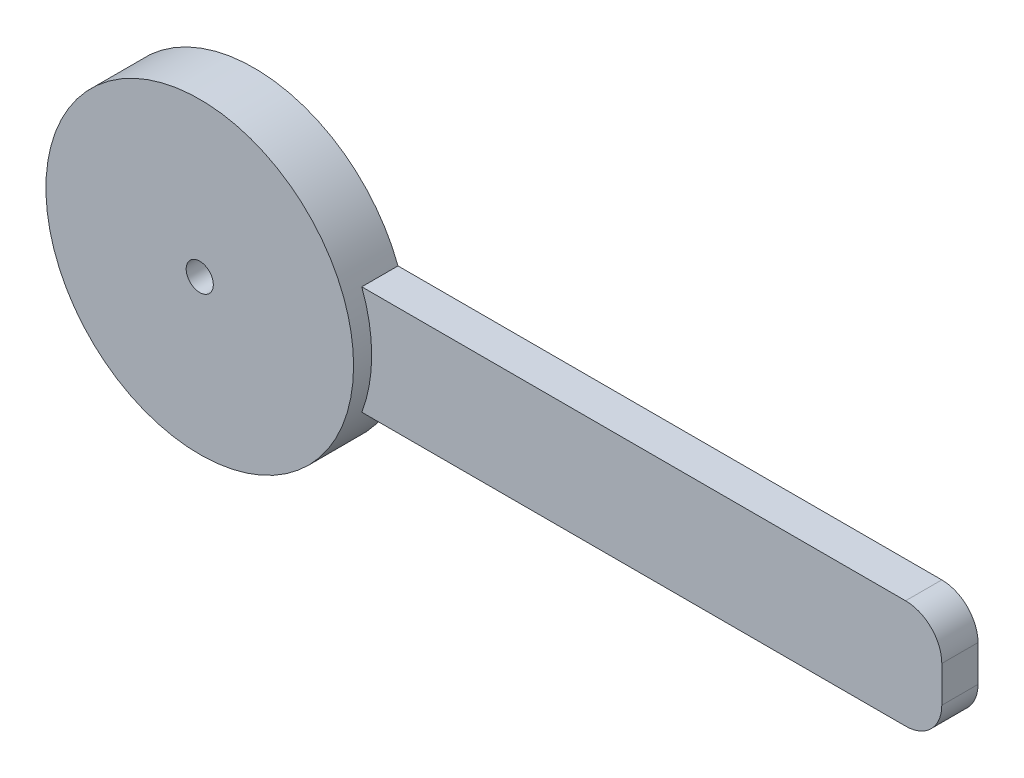
ISO-10303-21;
HEADER;
FILE_DESCRIPTION(('STEP AP214'),'2;1');
FILE_NAME('part.step','',(''),(''),'','','');
FILE_SCHEMA(('AUTOMOTIVE_DESIGN { 1 0 10303 214 1 1 1 1 }'));
ENDSEC;
DATA;
#1=APPLICATION_CONTEXT('core data for automotive mechanical design processes');
#2=APPLICATION_PROTOCOL_DEFINITION('international standard','automotive_design',2000,#1);
#3=PRODUCT_CONTEXT('',#1,'mechanical');
#4=PRODUCT('Part','Part','',(#3));
#5=PRODUCT_RELATED_PRODUCT_CATEGORY('part','',(#4));
#6=PRODUCT_DEFINITION_FORMATION('','',#4);
#7=PRODUCT_DEFINITION_CONTEXT('part definition',#1,'design');
#8=PRODUCT_DEFINITION('design','',#6,#7);
#9=PRODUCT_DEFINITION_SHAPE('','',#8);
#10=(LENGTH_UNIT() NAMED_UNIT(*) SI_UNIT(.MILLI.,.METRE.));
#11=(NAMED_UNIT(*) PLANE_ANGLE_UNIT() SI_UNIT($,.RADIAN.));
#12=(NAMED_UNIT(*) SI_UNIT($,.STERADIAN.) SOLID_ANGLE_UNIT());
#13=UNCERTAINTY_MEASURE_WITH_UNIT(LENGTH_MEASURE(1.E-05),#10,'distance_accuracy_value','');
#14=(GEOMETRIC_REPRESENTATION_CONTEXT(3) GLOBAL_UNCERTAINTY_ASSIGNED_CONTEXT((#13)) GLOBAL_UNIT_ASSIGNED_CONTEXT((#10,
#11,#12)) REPRESENTATION_CONTEXT('',''));
#15=CARTESIAN_POINT('',(0.,0.,0.));
#16=DIRECTION('',(0.,0.,1.));
#17=DIRECTION('',(1.,0.,0.));
#18=AXIS2_PLACEMENT_3D('',#15,#16,#17);
#19=CARTESIAN_POINT('',(-1.29206476969242,-9.55773939224529,1.));
#20=DIRECTION('',(-0.133966605224204,-0.990985846863971,0.));
#21=DIRECTION('',(0.990985846863971,-0.133966605224204,0.));
#22=AXIS2_PLACEMENT_3D('',#19,#20,#21);
#23=PLANE('',#22);
#24=DIRECTION('',(-0.990985846863971,0.133966605224203,0.));
#25=VECTOR('',#24,1.);
#26=CARTESIAN_POINT('',(-1.29206476969242,-9.55773939224529,1.));
#27=LINE('',#26,#25);
#28=CARTESIAN_POINT('',(-47.3521116164976,-3.33110342962163,1.));
#29=VERTEX_POINT('',#28);
#30=CARTESIAN_POINT('',(-53.5,-2.5,1.));
#31=VERTEX_POINT('',#30);
#32=EDGE_CURVE('E355',#29,#31,#27,.T.);
#33=ORIENTED_EDGE('',*,*,#32,.F.);
#34=DIRECTION('',(0.,0.,1.));
#35=VECTOR('',#34,1.);
#36=CARTESIAN_POINT('',(-47.3521116164976,-3.33110342962163,-2.));
#37=LINE('',#36,#35);
#38=CARTESIAN_POINT('',(-47.3521116164976,-3.33110342962163,-2.));
#39=VERTEX_POINT('',#38);
#40=EDGE_CURVE('E427',#29,#39,#37,.F.);
#41=ORIENTED_EDGE('',*,*,#40,.T.);
#42=DIRECTION('',(-0.990985846863971,0.133966605224203,0.));
#43=VECTOR('',#42,1.);
#44=CARTESIAN_POINT('',(-1.29206476969242,-9.55773939224529,-2.));
#45=LINE('',#44,#43);
#46=CARTESIAN_POINT('',(-53.5,-2.5,-2.));
#47=VERTEX_POINT('',#46);
#48=EDGE_CURVE('E363',#39,#47,#45,.T.);
#49=ORIENTED_EDGE('',*,*,#48,.T.);
#50=DIRECTION('',(0.,0.,-1.));
#51=VECTOR('',#50,1.);
#52=CARTESIAN_POINT('',(-53.5,-2.5,1.));
#53=LINE('',#52,#51);
#54=EDGE_CURVE('E361',#31,#47,#53,.T.);
#55=ORIENTED_EDGE('',*,*,#54,.F.);
#56=EDGE_LOOP('',(#33,#41,#49,#55));
#57=FACE_BOUND('',#56,.T.);
#58=ADVANCED_FACE('F43',(#57),#23,.F.);
#59=CARTESIAN_POINT('',(0.,0.,-2.));
#60=DIRECTION('',(0.,0.,-1.));
#61=DIRECTION('',(-1.,0.,0.));
#62=AXIS2_PLACEMENT_3D('',#59,#60,#61);
#63=PLANE('',#62);
#64=ORIENTED_EDGE('',*,*,#48,.F.);
#65=CARTESIAN_POINT('',(-47.4860782217218,-4.3220892764856,-2.));
#66=DIRECTION('',(0.,0.,-1.));
#67=DIRECTION('',(-1.,0.,0.));
#68=AXIS2_PLACEMENT_3D('',#65,#66,#67);
#69=CIRCLE('',#68,1.);
#70=CARTESIAN_POINT('',(-46.5608760009346,-4.70156371653466,-2.));
#71=VERTEX_POINT('',#70);
#72=EDGE_CURVE('E439',#39,#71,#69,.T.);
#73=ORIENTED_EDGE('',*,*,#72,.T.);
#74=DIRECTION('',(-0.379474440049075,-0.925202220787132,0.));
#75=VECTOR('',#74,1.);
#76=CARTESIAN_POINT('',(-28.9232775012814,38.3009249336115,-2.));
#77=LINE('',#76,#75);
#78=CARTESIAN_POINT('',(-48.9150635094612,-10.4413429510898,-2.));
#79=VERTEX_POINT('',#78);
#80=EDGE_CURVE('E265',#71,#79,#77,.T.);
#81=ORIENTED_EDGE('',*,*,#80,.T.);
#82=CARTESIAN_POINT('',(-46.7500000000001,-11.6913429510898,-2.));
#83=DIRECTION('',(0.,0.,-1.));
#84=DIRECTION('',(-0.50000000000001,-0.866025403784433,0.));
#85=AXIS2_PLACEMENT_3D('',#82,#83,#84);
#86=CIRCLE('',#85,2.5);
#87=CARTESIAN_POINT('',(-44.5849364905391,-12.9413429510899,-2.));
#88=VERTEX_POINT('',#87);
#89=EDGE_CURVE('E269',#88,#79,#86,.T.);
#90=ORIENTED_EDGE('',*,*,#89,.F.);
#91=DIRECTION('',(-0.611511406814916,-0.791235615562926,0.));
#92=VECTOR('',#91,1.);
#93=CARTESIAN_POINT('',(-12.3687872684102,28.7431855413661,-2.));
#94=LINE('',#93,#92);
#95=CARTESIAN_POINT('',(-40.791235615563,-8.03266714615628,-2.));
#96=VERTEX_POINT('',#95);
#97=EDGE_CURVE('E253',#96,#88,#94,.T.);
#98=ORIENTED_EDGE('',*,*,#97,.F.);
#99=CARTESIAN_POINT('',(-40.0000000000001,-8.64417855297121,-2.));
#100=DIRECTION('',(0.,0.,-1.));
#101=DIRECTION('',(-1.,0.,0.));
#102=AXIS2_PLACEMENT_3D('',#99,#100,#101);
#103=CIRCLE('',#102,1.);
#104=CARTESIAN_POINT('',(-39.2087643844372,-8.0326671461563,-2.));
#105=VERTEX_POINT('',#104);
#106=EDGE_CURVE('E429',#96,#105,#103,.T.);
#107=ORIENTED_EDGE('',*,*,#106,.T.);
#108=DIRECTION('',(0.6115114068149,-0.791235615562939,0.));
#109=VECTOR('',#108,1.);
#110=CARTESIAN_POINT('',(-67.6312127315892,28.7431855413666,-2.));
#111=LINE('',#110,#109);
#112=CARTESIAN_POINT('',(-35.4150635094612,-12.94134295109,-2.));
#113=VERTEX_POINT('',#112);
#114=EDGE_CURVE('E271',#105,#113,#111,.T.);
#115=ORIENTED_EDGE('',*,*,#114,.T.);
#116=CARTESIAN_POINT('',(-33.2500000000001,-11.69134295109,-2.));
#117=DIRECTION('',(0.,0.,-1.));
#118=DIRECTION('',(0.499999999999992,-0.866025403784443,0.));
#119=AXIS2_PLACEMENT_3D('',#116,#117,#118);
#120=CIRCLE('',#119,2.5);
#121=CARTESIAN_POINT('',(-31.084936490539,-10.44134295109,-2.));
#122=VERTEX_POINT('',#121);
#123=EDGE_CURVE('E276',#122,#113,#120,.T.);
#124=ORIENTED_EDGE('',*,*,#123,.F.);
#125=DIRECTION('',(0.379474440049056,-0.92520222078714,0.));
#126=VECTOR('',#125,1.);
#127=CARTESIAN_POINT('',(-51.0767224987178,38.3009249336118,-2.));
#128=LINE('',#127,#126);
#129=CARTESIAN_POINT('',(-33.4391239990655,-4.70156371653467,-2.));
#130=VERTEX_POINT('',#129);
#131=EDGE_CURVE('E283',#130,#122,#128,.T.);
#132=ORIENTED_EDGE('',*,*,#131,.F.);
#133=CARTESIAN_POINT('',(-32.5139217782784,-4.32208927648563,-2.));
#134=DIRECTION('',(0.,0.,-1.));
#135=DIRECTION('',(-1.,0.,0.));
#136=AXIS2_PLACEMENT_3D('',#133,#134,#135);
#137=CIRCLE('',#136,1.);
#138=CARTESIAN_POINT('',(-32.6478883835026,-3.33110342962165,-2.));
#139=VERTEX_POINT('',#138);
#140=EDGE_CURVE('E437',#130,#139,#137,.T.);
#141=ORIENTED_EDGE('',*,*,#140,.T.);
#142=DIRECTION('',(0.990985846863971,0.133966605224203,0.));
#143=VECTOR('',#142,1.);
#144=CARTESIAN_POINT('',(-78.7079352303076,-9.55773939224529,-2.));
#145=LINE('',#144,#143);
#146=CARTESIAN_POINT('',(-26.5,-2.5,-2.));
#147=VERTEX_POINT('',#146);
#148=EDGE_CURVE('E290',#139,#147,#145,.T.);
#149=ORIENTED_EDGE('',*,*,#148,.T.);
#150=CARTESIAN_POINT('',(-26.5,0.,-2.));
#151=DIRECTION('',(0.,0.,-1.));
#152=DIRECTION('',(1.,0.,0.));
#153=AXIS2_PLACEMENT_3D('',#150,#151,#152);
#154=CIRCLE('',#153,2.5);
#155=CARTESIAN_POINT('',(-26.5,2.5,-2.));
#156=VERTEX_POINT('',#155);
#157=EDGE_CURVE('E296',#156,#147,#154,.T.);
#158=ORIENTED_EDGE('',*,*,#157,.F.);
#159=DIRECTION('',(0.990985846863971,-0.133966605224203,0.));
#160=VECTOR('',#159,1.);
#161=CARTESIAN_POINT('',(-78.7079352303076,9.55773939224528,-2.));
#162=LINE('',#161,#160);
#163=CARTESIAN_POINT('',(-32.6478883835025,3.33110342962163,-2.));
#164=VERTEX_POINT('',#163);
#165=EDGE_CURVE('E303',#164,#156,#162,.T.);
#166=ORIENTED_EDGE('',*,*,#165,.F.);
#167=CARTESIAN_POINT('',(-32.5139217782783,4.3220892764856,-2.));
#168=DIRECTION('',(0.,0.,-1.));
#169=DIRECTION('',(-1.,0.,0.));
#170=AXIS2_PLACEMENT_3D('',#167,#168,#169);
#171=CIRCLE('',#170,1.);
#172=CARTESIAN_POINT('',(-33.4391239990654,4.70156371653468,-2.));
#173=VERTEX_POINT('',#172);
#174=EDGE_CURVE('E431',#164,#173,#171,.T.);
#175=ORIENTED_EDGE('',*,*,#174,.T.);
#176=DIRECTION('',(0.379474440049069,0.925202220787135,0.));
#177=VECTOR('',#176,1.);
#178=CARTESIAN_POINT('',(-51.0767224987183,-38.3009249336116,-2.));
#179=LINE('',#178,#177);
#180=CARTESIAN_POINT('',(-31.0849364905389,10.4413429510899,-2.));
#181=VERTEX_POINT('',#180);
#182=EDGE_CURVE('E310',#173,#181,#179,.T.);
#183=ORIENTED_EDGE('',*,*,#182,.T.);
#184=CARTESIAN_POINT('',(-33.25,11.6913429510899,-2.));
#185=DIRECTION('',(0.,0.,-1.));
#186=DIRECTION('',(0.500000000000004,0.866025403784436,0.));
#187=AXIS2_PLACEMENT_3D('',#184,#185,#186);
#188=CIRCLE('',#187,2.5);
#189=CARTESIAN_POINT('',(-35.4150635094611,12.9413429510899,-2.));
#190=VERTEX_POINT('',#189);
#191=EDGE_CURVE('E316',#190,#181,#188,.T.);
#192=ORIENTED_EDGE('',*,*,#191,.F.);
#193=DIRECTION('',(0.611511406814911,0.79123561556293,0.));
#194=VECTOR('',#193,1.);
#195=CARTESIAN_POINT('',(-67.6312127315896,-28.7431855413663,-2.));
#196=LINE('',#195,#194);
#197=CARTESIAN_POINT('',(-39.2087643844371,8.0326671461563,-2.));
#198=VERTEX_POINT('',#197);
#199=EDGE_CURVE('E323',#198,#190,#196,.T.);
#200=ORIENTED_EDGE('',*,*,#199,.F.);
#201=CARTESIAN_POINT('',(-40.,8.64417855297121,-2.));
#202=DIRECTION('',(0.,0.,-1.));
#203=DIRECTION('',(-1.,0.,0.));
#204=AXIS2_PLACEMENT_3D('',#201,#202,#203);
#205=CIRCLE('',#204,1.);
#206=CARTESIAN_POINT('',(-40.7912356155629,8.03266714615631,-2.));
#207=VERTEX_POINT('',#206);
#208=EDGE_CURVE('E433',#198,#207,#205,.T.);
#209=ORIENTED_EDGE('',*,*,#208,.T.);
#210=DIRECTION('',(-0.611511406814905,0.791235615562934,0.));
#211=VECTOR('',#210,1.);
#212=CARTESIAN_POINT('',(-12.3687872684106,-28.7431855413665,-2.));
#213=LINE('',#212,#211);
#214=CARTESIAN_POINT('',(-44.5849364905389,12.9413429510899,-2.));
#215=VERTEX_POINT('',#214);
#216=EDGE_CURVE('E330',#207,#215,#213,.T.);
#217=ORIENTED_EDGE('',*,*,#216,.T.);
#218=CARTESIAN_POINT('',(-46.75,11.6913429510899,-2.));
#219=DIRECTION('',(0.,0.,-1.));
#220=DIRECTION('',(-0.499999999999998,0.86602540378444,0.));
#221=AXIS2_PLACEMENT_3D('',#218,#219,#220);
#222=CIRCLE('',#221,2.5);
#223=CARTESIAN_POINT('',(-48.9150635094611,10.4413429510899,-2.));
#224=VERTEX_POINT('',#223);
#225=EDGE_CURVE('E336',#224,#215,#222,.T.);
#226=ORIENTED_EDGE('',*,*,#225,.F.);
#227=DIRECTION('',(-0.379474440049062,0.925202220787137,0.));
#228=VECTOR('',#227,1.);
#229=CARTESIAN_POINT('',(-28.923277501282,-38.3009249336117,-2.));
#230=LINE('',#229,#228);
#231=CARTESIAN_POINT('',(-46.5608760009345,4.70156371653468,-2.));
#232=VERTEX_POINT('',#231);
#233=EDGE_CURVE('E343',#232,#224,#230,.T.);
#234=ORIENTED_EDGE('',*,*,#233,.F.);
#235=CARTESIAN_POINT('',(-47.4860782217217,4.32208927648561,-2.));
#236=DIRECTION('',(0.,0.,-1.));
#237=DIRECTION('',(-1.,0.,0.));
#238=AXIS2_PLACEMENT_3D('',#235,#236,#237);
#239=CIRCLE('',#238,1.);
#240=CARTESIAN_POINT('',(-47.3521116164975,3.33110342962164,-2.));
#241=VERTEX_POINT('',#240);
#242=EDGE_CURVE('E435',#232,#241,#239,.T.);
#243=ORIENTED_EDGE('',*,*,#242,.T.);
#244=DIRECTION('',(-0.990985846863971,-0.133966605224203,0.));
#245=VECTOR('',#244,1.);
#246=CARTESIAN_POINT('',(-1.29206476969242,9.55773939224528,-2.));
#247=LINE('',#246,#245);
#248=CARTESIAN_POINT('',(-53.5,2.5,-2.));
#249=VERTEX_POINT('',#248);
#250=EDGE_CURVE('E350',#241,#249,#247,.T.);
#251=ORIENTED_EDGE('',*,*,#250,.T.);
#252=CARTESIAN_POINT('',(-53.5,0.,-2.));
#253=DIRECTION('',(0.,0.,-1.));
#254=DIRECTION('',(-1.,0.,0.));
#255=AXIS2_PLACEMENT_3D('',#252,#253,#254);
#256=CIRCLE('',#255,2.5);
#257=EDGE_CURVE('E356',#47,#249,#256,.T.);
#258=ORIENTED_EDGE('',*,*,#257,.F.);
#259=EDGE_LOOP('',(#64,#73,#81,#90,#98,#107,#115,#124,#132,#141,#149,#158,#166,#175,#183,#192,
#200,#209,#217,#226,#234,#243,#251,#258));
#260=FACE_BOUND('',#259,.T.);
#261=CARTESIAN_POINT('',(35.,0.,-2.));
#262=DIRECTION('',(0.,0.,1.));
#263=DIRECTION('',(-1.,0.,0.));
#264=AXIS2_PLACEMENT_3D('',#261,#262,#263);
#265=CIRCLE('',#264,2.75);
#266=CARTESIAN_POINT('',(32.25,0.,-2.));
#267=VERTEX_POINT('',#266);
#268=EDGE_CURVE('E387',#267,#267,#265,.F.);
#269=ORIENTED_EDGE('',*,*,#268,.F.);
#270=EDGE_LOOP('',(#269));
#271=FACE_BOUND('',#270,.T.);
#272=DIRECTION('',(1.,0.,0.));
#273=VECTOR('',#272,1.);
#274=CARTESIAN_POINT('',(-40.,-6.,-2.));
#275=LINE('',#274,#273);
#276=CARTESIAN_POINT('',(-24.0940262794131,-6.,-2.));
#277=VERTEX_POINT('',#276);
#278=CARTESIAN_POINT('',(36.,-6.,-2.));
#279=VERTEX_POINT('',#278);
#280=EDGE_CURVE('E395',#277,#279,#275,.T.);
#281=ORIENTED_EDGE('',*,*,#280,.F.);
#282=CARTESIAN_POINT('',(-40.,0.,-2.));
#283=DIRECTION('',(0.,0.,-1.));
#284=DIRECTION('',(-1.,0.,0.));
#285=AXIS2_PLACEMENT_3D('',#282,#283,#284);
#286=CIRCLE('',#285,17.);
#287=CARTESIAN_POINT('',(-24.0940262794131,6.,-2.));
#288=VERTEX_POINT('',#287);
#289=EDGE_CURVE('E370',#288,#277,#286,.F.);
#290=ORIENTED_EDGE('',*,*,#289,.F.);
#291=DIRECTION('',(-1.,0.,0.));
#292=VECTOR('',#291,1.);
#293=CARTESIAN_POINT('',(-40.,6.,-2.));
#294=LINE('',#293,#292);
#295=CARTESIAN_POINT('',(36.,6.,-2.));
#296=VERTEX_POINT('',#295);
#297=EDGE_CURVE('E402',#296,#288,#294,.T.);
#298=ORIENTED_EDGE('',*,*,#297,.F.);
#299=CARTESIAN_POINT('',(36.,2.,-2.));
#300=DIRECTION('',(0.,0.,-1.));
#301=DIRECTION('',(-1.,0.,0.));
#302=AXIS2_PLACEMENT_3D('',#299,#300,#301);
#303=CIRCLE('',#302,4.);
#304=CARTESIAN_POINT('',(40.,2.,-2.));
#305=VERTEX_POINT('',#304);
#306=EDGE_CURVE('E409',#296,#305,#303,.T.);
#307=ORIENTED_EDGE('',*,*,#306,.T.);
#308=DIRECTION('',(0.,1.,0.));
#309=VECTOR('',#308,1.);
#310=CARTESIAN_POINT('',(40.,-6.,-2.));
#311=LINE('',#310,#309);
#312=CARTESIAN_POINT('',(40.,-2.,-2.));
#313=VERTEX_POINT('',#312);
#314=EDGE_CURVE('E390',#313,#305,#311,.T.);
#315=ORIENTED_EDGE('',*,*,#314,.F.);
#316=CARTESIAN_POINT('',(36.,-2.,-2.));
#317=DIRECTION('',(0.,0.,-1.));
#318=DIRECTION('',(-1.,0.,0.));
#319=AXIS2_PLACEMENT_3D('',#316,#317,#318);
#320=CIRCLE('',#319,4.);
#321=EDGE_CURVE('E411',#313,#279,#320,.T.);
#322=ORIENTED_EDGE('',*,*,#321,.T.);
#323=EDGE_LOOP('',(#281,#290,#298,#307,#315,#322));
#324=FACE_BOUND('',#323,.T.);
#325=ADVANCED_FACE('F486',(#260,#271,#324),#63,.T.);
#326=CARTESIAN_POINT('',(-40.,6.,2.));
#327=DIRECTION('',(0.,-1.,0.));
#328=DIRECTION('',(0.,0.,-1.));
#329=AXIS2_PLACEMENT_3D('',#326,#327,#328);
#330=PLANE('',#329);
#331=DIRECTION('',(0.,0.,-1.));
#332=VECTOR('',#331,1.);
#333=CARTESIAN_POINT('',(-24.0940262794131,6.,4.));
#334=LINE('',#333,#332);
#335=CARTESIAN_POINT('',(-24.0940262794131,6.,2.));
#336=VERTEX_POINT('',#335);
#337=EDGE_CURVE('E384',#336,#288,#334,.T.);
#338=ORIENTED_EDGE('',*,*,#337,.F.);
#339=DIRECTION('',(-1.,0.,0.));
#340=VECTOR('',#339,1.);
#341=CARTESIAN_POINT('',(-40.,6.,2.));
#342=LINE('',#341,#340);
#343=CARTESIAN_POINT('',(36.,6.,2.));
#344=VERTEX_POINT('',#343);
#345=EDGE_CURVE('E394',#344,#336,#342,.T.);
#346=ORIENTED_EDGE('',*,*,#345,.F.);
#347=DIRECTION('',(0.,0.,-1.));
#348=VECTOR('',#347,1.);
#349=CARTESIAN_POINT('',(36.,6.,2.));
#350=LINE('',#349,#348);
#351=EDGE_CURVE('E421',#344,#296,#350,.T.);
#352=ORIENTED_EDGE('',*,*,#351,.T.);
#353=ORIENTED_EDGE('',*,*,#297,.T.);
#354=EDGE_LOOP('',(#338,#346,#352,#353));
#355=FACE_BOUND('',#354,.T.);
#356=ADVANCED_FACE('F587',(#355),#330,.F.);
#357=CARTESIAN_POINT('',(-40.,-6.,2.));
#358=DIRECTION('',(0.,1.,0.));
#359=DIRECTION('',(0.,0.,1.));
#360=AXIS2_PLACEMENT_3D('',#357,#358,#359);
#361=PLANE('',#360);
#362=DIRECTION('',(0.,0.,-1.));
#363=VECTOR('',#362,1.);
#364=CARTESIAN_POINT('',(-24.0940262794131,-6.,4.));
#365=LINE('',#364,#363);
#366=CARTESIAN_POINT('',(-24.0940262794131,-6.,2.));
#367=VERTEX_POINT('',#366);
#368=EDGE_CURVE('E381',#277,#367,#365,.F.);
#369=ORIENTED_EDGE('',*,*,#368,.F.);
#370=ORIENTED_EDGE('',*,*,#280,.T.);
#371=DIRECTION('',(0.,0.,-1.));
#372=VECTOR('',#371,1.);
#373=CARTESIAN_POINT('',(36.,-6.,2.));
#374=LINE('',#373,#372);
#375=CARTESIAN_POINT('',(36.,-6.,2.));
#376=VERTEX_POINT('',#375);
#377=EDGE_CURVE('E414',#279,#376,#374,.F.);
#378=ORIENTED_EDGE('',*,*,#377,.T.);
#379=DIRECTION('',(1.,0.,0.));
#380=VECTOR('',#379,1.);
#381=CARTESIAN_POINT('',(-40.,-6.,2.));
#382=LINE('',#381,#380);
#383=EDGE_CURVE('E397',#367,#376,#382,.T.);
#384=ORIENTED_EDGE('',*,*,#383,.F.);
#385=EDGE_LOOP('',(#369,#370,#378,#384));
#386=FACE_BOUND('',#385,.T.);
#387=ADVANCED_FACE('F571',(#386),#361,.F.);
#388=CARTESIAN_POINT('',(40.,-6.,2.));
#389=DIRECTION('',(-1.,0.,0.));
#390=DIRECTION('',(0.,0.,1.));
#391=AXIS2_PLACEMENT_3D('',#388,#389,#390);
#392=PLANE('',#391);
#393=DIRECTION('',(0.,1.,0.));
#394=VECTOR('',#393,1.);
#395=CARTESIAN_POINT('',(40.,-6.,2.));
#396=LINE('',#395,#394);
#397=CARTESIAN_POINT('',(40.,-2.,2.));
#398=VERTEX_POINT('',#397);
#399=CARTESIAN_POINT('',(40.,2.,2.));
#400=VERTEX_POINT('',#399);
#401=EDGE_CURVE('E391',#398,#400,#396,.T.);
#402=ORIENTED_EDGE('',*,*,#401,.F.);
#403=DIRECTION('',(0.,0.,-1.));
#404=VECTOR('',#403,1.);
#405=CARTESIAN_POINT('',(40.,-2.,2.));
#406=LINE('',#405,#404);
#407=EDGE_CURVE('E406',#398,#313,#406,.T.);
#408=ORIENTED_EDGE('',*,*,#407,.T.);
#409=ORIENTED_EDGE('',*,*,#314,.T.);
#410=DIRECTION('',(0.,0.,-1.));
#411=VECTOR('',#410,1.);
#412=CARTESIAN_POINT('',(40.,2.,2.));
#413=LINE('',#412,#411);
#414=EDGE_CURVE('E399',#305,#400,#413,.F.);
#415=ORIENTED_EDGE('',*,*,#414,.T.);
#416=EDGE_LOOP('',(#402,#408,#409,#415));
#417=FACE_BOUND('',#416,.T.);
#418=ADVANCED_FACE('F581',(#417),#392,.F.);
#419=CARTESIAN_POINT('',(0.,0.,2.));
#420=DIRECTION('',(0.,0.,-1.));
#421=DIRECTION('',(-1.,0.,0.));
#422=AXIS2_PLACEMENT_3D('',#419,#420,#421);
#423=PLANE('',#422);
#424=CARTESIAN_POINT('',(-40.,0.,2.));
#425=DIRECTION('',(0.,0.,-1.));
#426=DIRECTION('',(-1.,0.,0.));
#427=AXIS2_PLACEMENT_3D('',#424,#425,#426);
#428=CIRCLE('',#427,17.);
#429=EDGE_CURVE('E378',#367,#336,#428,.F.);
#430=ORIENTED_EDGE('',*,*,#429,.F.);
#431=ORIENTED_EDGE('',*,*,#383,.T.);
#432=CARTESIAN_POINT('',(36.,-2.,2.));
#433=DIRECTION('',(0.,0.,-1.));
#434=DIRECTION('',(-1.,0.,0.));
#435=AXIS2_PLACEMENT_3D('',#432,#433,#434);
#436=CIRCLE('',#435,4.);
#437=EDGE_CURVE('E419',#376,#398,#436,.F.);
#438=ORIENTED_EDGE('',*,*,#437,.T.);
#439=ORIENTED_EDGE('',*,*,#401,.T.);
#440=CARTESIAN_POINT('',(36.,2.,2.));
#441=DIRECTION('',(0.,0.,-1.));
#442=DIRECTION('',(-1.,0.,0.));
#443=AXIS2_PLACEMENT_3D('',#440,#441,#442);
#444=CIRCLE('',#443,4.);
#445=EDGE_CURVE('E417',#400,#344,#444,.F.);
#446=ORIENTED_EDGE('',*,*,#445,.T.);
#447=ORIENTED_EDGE('',*,*,#345,.T.);
#448=EDGE_LOOP('',(#430,#431,#438,#439,#446,#447));
#449=FACE_BOUND('',#448,.T.);
#450=ADVANCED_FACE('F568',(#449),#423,.F.);
#451=CARTESIAN_POINT('',(35.,0.,-2.));
#452=DIRECTION('',(1.,0.,0.));
#453=DIRECTION('',(0.,-1.,0.));
#454=AXIS2_PLACEMENT_3D('',#451,#452,#453);
#455=SPHERICAL_SURFACE('',#454,2.75);
#456=CARTESIAN_POINT('',(35.,0.,-2.));
#457=DIRECTION('',(0.,0.,1.));
#458=DIRECTION('',(-1.,0.,0.));
#459=AXIS2_PLACEMENT_3D('',#456,#457,#458);
#460=SPHERICAL_SURFACE('',#459,2.75);
#461=ORIENTED_EDGE('',*,*,#268,.T.);
#462=EDGE_LOOP('',(#461));
#463=FACE_BOUND('',#462,.T.);
#464=ADVANCED_FACE('F607',(#463),#460,.F.);
#465=CARTESIAN_POINT('',(36.,-2.,2.));
#466=DIRECTION('',(0.,0.,-1.));
#467=DIRECTION('',(-1.,0.,0.));
#468=AXIS2_PLACEMENT_3D('',#465,#466,#467);
#469=CYLINDRICAL_SURFACE('',#468,4.);
#470=ORIENTED_EDGE('',*,*,#437,.F.);
#471=ORIENTED_EDGE('',*,*,#377,.F.);
#472=ORIENTED_EDGE('',*,*,#321,.F.);
#473=ORIENTED_EDGE('',*,*,#407,.F.);
#474=EDGE_LOOP('',(#470,#471,#472,#473));
#475=FACE_BOUND('',#474,.T.);
#476=ADVANCED_FACE('F577',(#475),#469,.T.);
#477=CARTESIAN_POINT('',(36.,2.,2.));
#478=DIRECTION('',(0.,0.,-1.));
#479=DIRECTION('',(-1.,0.,0.));
#480=AXIS2_PLACEMENT_3D('',#477,#478,#479);
#481=CYLINDRICAL_SURFACE('',#480,4.);
#482=ORIENTED_EDGE('',*,*,#445,.F.);
#483=ORIENTED_EDGE('',*,*,#414,.F.);
#484=ORIENTED_EDGE('',*,*,#306,.F.);
#485=ORIENTED_EDGE('',*,*,#351,.F.);
#486=EDGE_LOOP('',(#482,#483,#484,#485));
#487=FACE_BOUND('',#486,.T.);
#488=ADVANCED_FACE('F562',(#487),#481,.T.);
#489=CARTESIAN_POINT('',(-40.,0.,4.));
#490=DIRECTION('',(0.,0.,-1.));
#491=DIRECTION('',(-1.,0.,0.));
#492=AXIS2_PLACEMENT_3D('',#489,#490,#491);
#493=CYLINDRICAL_SURFACE('',#492,17.);
#494=CARTESIAN_POINT('',(-40.,0.,4.));
#495=DIRECTION('',(0.,0.,1.));
#496=DIRECTION('',(1.,0.,0.));
#497=AXIS2_PLACEMENT_3D('',#494,#495,#496);
#498=CIRCLE('',#497,17.);
#499=CARTESIAN_POINT('',(-23.,0.,4.));
#500=VERTEX_POINT('',#499);
#501=EDGE_CURVE('E375',#500,#500,#498,.T.);
#502=ORIENTED_EDGE('',*,*,#501,.F.);
#503=EDGE_LOOP('',(#502));
#504=FACE_BOUND('',#503,.T.);
#505=ORIENTED_EDGE('',*,*,#429,.T.);
#506=ORIENTED_EDGE('',*,*,#337,.T.);
#507=ORIENTED_EDGE('',*,*,#289,.T.);
#508=ORIENTED_EDGE('',*,*,#368,.T.);
#509=EDGE_LOOP('',(#505,#506,#507,#508));
#510=FACE_BOUND('',#509,.T.);
#511=ADVANCED_FACE('F556',(#504,#510),#493,.T.);
#512=CARTESIAN_POINT('',(-40.,0.,4.));
#513=DIRECTION('',(0.,0.,1.));
#514=DIRECTION('',(1.,0.,0.));
#515=AXIS2_PLACEMENT_3D('',#512,#513,#514);
#516=PLANE('',#515);
#517=CARTESIAN_POINT('',(-40.,0.,4.));
#518=DIRECTION('',(0.,0.,1.));
#519=DIRECTION('',(1.,0.,0.));
#520=AXIS2_PLACEMENT_3D('',#517,#518,#519);
#521=CIRCLE('',#520,1.5);
#522=CARTESIAN_POINT('',(-38.5,0.,4.));
#523=VERTEX_POINT('',#522);
#524=EDGE_CURVE('E267',#523,#523,#521,.T.);
#525=ORIENTED_EDGE('',*,*,#524,.F.);
#526=EDGE_LOOP('',(#525));
#527=FACE_BOUND('',#526,.T.);
#528=ORIENTED_EDGE('',*,*,#501,.T.);
#529=EDGE_LOOP('',(#528));
#530=FACE_BOUND('',#529,.T.);
#531=ADVANCED_FACE('F553',(#527,#530),#516,.T.);
#532=CARTESIAN_POINT('',(-1.29206476969242,9.55773939224528,1.));
#533=DIRECTION('',(0.133966605224204,-0.990985846863971,0.));
#534=DIRECTION('',(0.990985846863971,0.133966605224204,0.));
#535=AXIS2_PLACEMENT_3D('',#532,#533,#534);
#536=PLANE('',#535);
#537=ORIENTED_EDGE('',*,*,#250,.F.);
#538=DIRECTION('',(0.,0.,-1.));
#539=VECTOR('',#538,1.);
#540=CARTESIAN_POINT('',(-47.3521116164975,3.33110342962164,1.));
#541=LINE('',#540,#539);
#542=CARTESIAN_POINT('',(-47.3521116164975,3.33110342962164,1.));
#543=VERTEX_POINT('',#542);
#544=EDGE_CURVE('E449',#241,#543,#541,.F.);
#545=ORIENTED_EDGE('',*,*,#544,.T.);
#546=DIRECTION('',(-0.990985846863971,-0.133966605224203,0.));
#547=VECTOR('',#546,1.);
#548=CARTESIAN_POINT('',(-1.29206476969242,9.55773939224528,1.));
#549=LINE('',#548,#547);
#550=CARTESIAN_POINT('',(-53.5,2.5,1.));
#551=VERTEX_POINT('',#550);
#552=EDGE_CURVE('E353',#543,#551,#549,.T.);
#553=ORIENTED_EDGE('',*,*,#552,.T.);
#554=DIRECTION('',(0.,0.,-1.));
#555=VECTOR('',#554,1.);
#556=CARTESIAN_POINT('',(-53.5,2.5,1.));
#557=LINE('',#556,#555);
#558=EDGE_CURVE('E367',#551,#249,#557,.T.);
#559=ORIENTED_EDGE('',*,*,#558,.T.);
#560=EDGE_LOOP('',(#537,#545,#553,#559));
#561=FACE_BOUND('',#560,.T.);
#562=ADVANCED_FACE('F527',(#561),#536,.T.);
#563=CARTESIAN_POINT('',(-53.5,0.,1.));
#564=DIRECTION('',(0.,0.,-1.));
#565=DIRECTION('',(-1.,0.,0.));
#566=AXIS2_PLACEMENT_3D('',#563,#564,#565);
#567=CYLINDRICAL_SURFACE('',#566,2.5);
#568=ORIENTED_EDGE('',*,*,#257,.T.);
#569=ORIENTED_EDGE('',*,*,#558,.F.);
#570=CARTESIAN_POINT('',(-53.5,0.,1.));
#571=DIRECTION('',(0.,0.,-1.));
#572=DIRECTION('',(-1.,0.,0.));
#573=AXIS2_PLACEMENT_3D('',#570,#571,#572);
#574=CIRCLE('',#573,2.5);
#575=EDGE_CURVE('E358',#31,#551,#574,.T.);
#576=ORIENTED_EDGE('',*,*,#575,.F.);
#577=ORIENTED_EDGE('',*,*,#54,.T.);
#578=EDGE_LOOP('',(#568,#569,#576,#577));
#579=FACE_BOUND('',#578,.T.);
#580=ADVANCED_FACE('F533',(#579),#567,.F.);
#581=CARTESIAN_POINT('',(0.,0.,1.));
#582=DIRECTION('',(0.,0.,-1.));
#583=DIRECTION('',(-1.,0.,0.));
#584=AXIS2_PLACEMENT_3D('',#581,#582,#583);
#585=PLANE('',#584);
#586=CARTESIAN_POINT('',(-40.,0.,1.));
#587=DIRECTION('',(0.,0.,-1.));
#588=DIRECTION('',(-1.,0.,0.));
#589=AXIS2_PLACEMENT_3D('',#586,#587,#588);
#590=CIRCLE('',#589,1.5);
#591=CARTESIAN_POINT('',(-41.5,0.,1.));
#592=VERTEX_POINT('',#591);
#593=EDGE_CURVE('E545',#592,#592,#590,.F.);
#594=ORIENTED_EDGE('',*,*,#593,.T.);
#595=EDGE_LOOP('',(#594));
#596=FACE_BOUND('',#595,.T.);
#597=ORIENTED_EDGE('',*,*,#552,.F.);
#598=CARTESIAN_POINT('',(-47.4860782217217,4.32208927648561,1.));
#599=DIRECTION('',(0.,0.,-1.));
#600=DIRECTION('',(-1.,0.,0.));
#601=AXIS2_PLACEMENT_3D('',#598,#599,#600);
#602=CIRCLE('',#601,1.);
#603=CARTESIAN_POINT('',(-46.5608760009345,4.70156371653468,1.));
#604=VERTEX_POINT('',#603);
#605=EDGE_CURVE('E468',#543,#604,#602,.F.);
#606=ORIENTED_EDGE('',*,*,#605,.T.);
#607=DIRECTION('',(-0.379474440049062,0.925202220787137,0.));
#608=VECTOR('',#607,1.);
#609=CARTESIAN_POINT('',(-28.923277501282,-38.3009249336117,1.));
#610=LINE('',#609,#608);
#611=CARTESIAN_POINT('',(-48.9150635094611,10.4413429510899,1.));
#612=VERTEX_POINT('',#611);
#613=EDGE_CURVE('E335',#604,#612,#610,.T.);
#614=ORIENTED_EDGE('',*,*,#613,.T.);
#615=CARTESIAN_POINT('',(-46.75,11.6913429510899,1.));
#616=DIRECTION('',(0.,0.,-1.));
#617=DIRECTION('',(-0.499999999999998,0.86602540378444,0.));
#618=AXIS2_PLACEMENT_3D('',#615,#616,#617);
#619=CIRCLE('',#618,2.5);
#620=CARTESIAN_POINT('',(-44.5849364905389,12.9413429510899,1.));
#621=VERTEX_POINT('',#620);
#622=EDGE_CURVE('E338',#612,#621,#619,.T.);
#623=ORIENTED_EDGE('',*,*,#622,.T.);
#624=DIRECTION('',(-0.611511406814905,0.791235615562934,0.));
#625=VECTOR('',#624,1.);
#626=CARTESIAN_POINT('',(-12.3687872684106,-28.7431855413665,1.));
#627=LINE('',#626,#625);
#628=CARTESIAN_POINT('',(-40.7912356155629,8.03266714615631,1.));
#629=VERTEX_POINT('',#628);
#630=EDGE_CURVE('E333',#629,#621,#627,.T.);
#631=ORIENTED_EDGE('',*,*,#630,.F.);
#632=CARTESIAN_POINT('',(-40.,8.64417855297121,1.));
#633=DIRECTION('',(0.,0.,-1.));
#634=DIRECTION('',(-1.,0.,0.));
#635=AXIS2_PLACEMENT_3D('',#632,#633,#634);
#636=CIRCLE('',#635,1.);
#637=CARTESIAN_POINT('',(-39.2087643844371,8.0326671461563,1.));
#638=VERTEX_POINT('',#637);
#639=EDGE_CURVE('E470',#629,#638,#636,.F.);
#640=ORIENTED_EDGE('',*,*,#639,.T.);
#641=DIRECTION('',(0.611511406814911,0.79123561556293,0.));
#642=VECTOR('',#641,1.);
#643=CARTESIAN_POINT('',(-67.6312127315896,-28.7431855413663,1.));
#644=LINE('',#643,#642);
#645=CARTESIAN_POINT('',(-35.4150635094611,12.9413429510899,1.));
#646=VERTEX_POINT('',#645);
#647=EDGE_CURVE('E315',#638,#646,#644,.T.);
#648=ORIENTED_EDGE('',*,*,#647,.T.);
#649=CARTESIAN_POINT('',(-33.25,11.6913429510899,1.));
#650=DIRECTION('',(0.,0.,-1.));
#651=DIRECTION('',(0.500000000000004,0.866025403784436,0.));
#652=AXIS2_PLACEMENT_3D('',#649,#650,#651);
#653=CIRCLE('',#652,2.5);
#654=CARTESIAN_POINT('',(-31.0849364905389,10.4413429510899,1.));
#655=VERTEX_POINT('',#654);
#656=EDGE_CURVE('E318',#646,#655,#653,.T.);
#657=ORIENTED_EDGE('',*,*,#656,.T.);
#658=DIRECTION('',(0.379474440049069,0.925202220787135,0.));
#659=VECTOR('',#658,1.);
#660=CARTESIAN_POINT('',(-51.0767224987183,-38.3009249336116,1.));
#661=LINE('',#660,#659);
#662=CARTESIAN_POINT('',(-33.4391239990654,4.70156371653468,1.));
#663=VERTEX_POINT('',#662);
#664=EDGE_CURVE('E313',#663,#655,#661,.T.);
#665=ORIENTED_EDGE('',*,*,#664,.F.);
#666=CARTESIAN_POINT('',(-32.5139217782783,4.3220892764856,1.));
#667=DIRECTION('',(0.,0.,-1.));
#668=DIRECTION('',(-1.,0.,0.));
#669=AXIS2_PLACEMENT_3D('',#666,#667,#668);
#670=CIRCLE('',#669,1.);
#671=CARTESIAN_POINT('',(-32.6478883835025,3.33110342962163,1.));
#672=VERTEX_POINT('',#671);
#673=EDGE_CURVE('E51',#663,#672,#670,.F.);
#674=ORIENTED_EDGE('',*,*,#673,.T.);
#675=DIRECTION('',(0.990985846863971,-0.133966605224203,0.));
#676=VECTOR('',#675,1.);
#677=CARTESIAN_POINT('',(-78.7079352303076,9.55773939224528,1.));
#678=LINE('',#677,#676);
#679=CARTESIAN_POINT('',(-26.5,2.5,1.));
#680=VERTEX_POINT('',#679);
#681=EDGE_CURVE('E295',#672,#680,#678,.T.);
#682=ORIENTED_EDGE('',*,*,#681,.T.);
#683=CARTESIAN_POINT('',(-26.5,0.,1.));
#684=DIRECTION('',(0.,0.,-1.));
#685=DIRECTION('',(1.,0.,0.));
#686=AXIS2_PLACEMENT_3D('',#683,#684,#685);
#687=CIRCLE('',#686,2.5);
#688=CARTESIAN_POINT('',(-26.5,-2.5,1.));
#689=VERTEX_POINT('',#688);
#690=EDGE_CURVE('E298',#680,#689,#687,.T.);
#691=ORIENTED_EDGE('',*,*,#690,.T.);
#692=DIRECTION('',(0.990985846863971,0.133966605224203,0.));
#693=VECTOR('',#692,1.);
#694=CARTESIAN_POINT('',(-78.7079352303076,-9.55773939224529,1.));
#695=LINE('',#694,#693);
#696=CARTESIAN_POINT('',(-32.6478883835026,-3.33110342962165,1.));
#697=VERTEX_POINT('',#696);
#698=EDGE_CURVE('E293',#697,#689,#695,.T.);
#699=ORIENTED_EDGE('',*,*,#698,.F.);
#700=CARTESIAN_POINT('',(-32.5139217782784,-4.32208927648563,1.));
#701=DIRECTION('',(0.,0.,-1.));
#702=DIRECTION('',(-1.,0.,0.));
#703=AXIS2_PLACEMENT_3D('',#700,#701,#702);
#704=CIRCLE('',#703,1.);
#705=CARTESIAN_POINT('',(-33.4391239990655,-4.70156371653467,1.));
#706=VERTEX_POINT('',#705);
#707=EDGE_CURVE('E466',#697,#706,#704,.F.);
#708=ORIENTED_EDGE('',*,*,#707,.T.);
#709=DIRECTION('',(0.379474440049056,-0.92520222078714,0.));
#710=VECTOR('',#709,1.);
#711=CARTESIAN_POINT('',(-51.0767224987178,38.3009249336118,1.));
#712=LINE('',#711,#710);
#713=CARTESIAN_POINT('',(-31.084936490539,-10.44134295109,1.));
#714=VERTEX_POINT('',#713);
#715=EDGE_CURVE('E275',#706,#714,#712,.T.);
#716=ORIENTED_EDGE('',*,*,#715,.T.);
#717=CARTESIAN_POINT('',(-33.2500000000001,-11.69134295109,1.));
#718=DIRECTION('',(0.,0.,-1.));
#719=DIRECTION('',(0.499999999999992,-0.866025403784443,0.));
#720=AXIS2_PLACEMENT_3D('',#717,#718,#719);
#721=CIRCLE('',#720,2.5);
#722=CARTESIAN_POINT('',(-35.4150635094612,-12.94134295109,1.));
#723=VERTEX_POINT('',#722);
#724=EDGE_CURVE('E278',#714,#723,#721,.T.);
#725=ORIENTED_EDGE('',*,*,#724,.T.);
#726=DIRECTION('',(0.6115114068149,-0.791235615562939,0.));
#727=VECTOR('',#726,1.);
#728=CARTESIAN_POINT('',(-67.6312127315892,28.7431855413666,1.));
#729=LINE('',#728,#727);
#730=CARTESIAN_POINT('',(-39.2087643844372,-8.0326671461563,1.));
#731=VERTEX_POINT('',#730);
#732=EDGE_CURVE('E273',#731,#723,#729,.T.);
#733=ORIENTED_EDGE('',*,*,#732,.F.);
#734=CARTESIAN_POINT('',(-40.0000000000001,-8.64417855297121,1.));
#735=DIRECTION('',(0.,0.,-1.));
#736=DIRECTION('',(-1.,0.,0.));
#737=AXIS2_PLACEMENT_3D('',#734,#735,#736);
#738=CIRCLE('',#737,1.);
#739=CARTESIAN_POINT('',(-40.791235615563,-8.03266714615628,1.));
#740=VERTEX_POINT('',#739);
#741=EDGE_CURVE('E11',#731,#740,#738,.F.);
#742=ORIENTED_EDGE('',*,*,#741,.T.);
#743=DIRECTION('',(-0.611511406814916,-0.791235615562926,0.));
#744=VECTOR('',#743,1.);
#745=CARTESIAN_POINT('',(-12.3687872684102,28.7431855413661,1.));
#746=LINE('',#745,#744);
#747=CARTESIAN_POINT('',(-44.5849364905391,-12.9413429510899,1.));
#748=VERTEX_POINT('',#747);
#749=EDGE_CURVE('E237',#740,#748,#746,.T.);
#750=ORIENTED_EDGE('',*,*,#749,.T.);
#751=CARTESIAN_POINT('',(-46.7500000000001,-11.6913429510898,1.));
#752=DIRECTION('',(0.,0.,-1.));
#753=DIRECTION('',(-0.50000000000001,-0.866025403784433,0.));
#754=AXIS2_PLACEMENT_3D('',#751,#752,#753);
#755=CIRCLE('',#754,2.5);
#756=CARTESIAN_POINT('',(-48.9150635094612,-10.4413429510898,1.));
#757=VERTEX_POINT('',#756);
#758=EDGE_CURVE('E243',#748,#757,#755,.T.);
#759=ORIENTED_EDGE('',*,*,#758,.T.);
#760=DIRECTION('',(-0.379474440049075,-0.925202220787132,0.));
#761=VECTOR('',#760,1.);
#762=CARTESIAN_POINT('',(-28.9232775012814,38.3009249336115,1.));
#763=LINE('',#762,#761);
#764=CARTESIAN_POINT('',(-46.5608760009346,-4.70156371653466,1.));
#765=VERTEX_POINT('',#764);
#766=EDGE_CURVE('E247',#765,#757,#763,.T.);
#767=ORIENTED_EDGE('',*,*,#766,.F.);
#768=CARTESIAN_POINT('',(-47.4860782217218,-4.3220892764856,1.));
#769=DIRECTION('',(0.,0.,-1.));
#770=DIRECTION('',(-1.,0.,0.));
#771=AXIS2_PLACEMENT_3D('',#768,#769,#770);
#772=CIRCLE('',#771,1.);
#773=EDGE_CURVE('E464',#765,#29,#772,.F.);
#774=ORIENTED_EDGE('',*,*,#773,.T.);
#775=ORIENTED_EDGE('',*,*,#32,.T.);
#776=ORIENTED_EDGE('',*,*,#575,.T.);
#777=EDGE_LOOP('',(#597,#606,#614,#623,#631,#640,#648,#657,#665,#674,#682,#691,#699,#708,#716,
#725,#733,#742,#750,#759,#767,#774,#775,#776));
#778=FACE_BOUND('',#777,.T.);
#779=ADVANCED_FACE('F240',(#596,#778),#585,.T.);
#780=CARTESIAN_POINT('',(-28.9232775012814,38.3009249336115,1.));
#781=DIRECTION('',(0.925202220787132,-0.379474440049075,0.));
#782=DIRECTION('',(0.379474440049075,0.925202220787132,0.));
#783=AXIS2_PLACEMENT_3D('',#780,#781,#782);
#784=PLANE('',#783);
#785=ORIENTED_EDGE('',*,*,#80,.F.);
#786=DIRECTION('',(0.,0.,1.));
#787=VECTOR('',#786,1.);
#788=CARTESIAN_POINT('',(-46.5608760009346,-4.70156371653467,1.));
#789=LINE('',#788,#787);
#790=EDGE_CURVE('E424',#71,#765,#789,.T.);
#791=ORIENTED_EDGE('',*,*,#790,.T.);
#792=ORIENTED_EDGE('',*,*,#766,.T.);
#793=DIRECTION('',(0.,0.,-1.));
#794=VECTOR('',#793,1.);
#795=CARTESIAN_POINT('',(-48.9150635094612,-10.4413429510898,1.));
#796=LINE('',#795,#794);
#797=EDGE_CURVE('E257',#757,#79,#796,.T.);
#798=ORIENTED_EDGE('',*,*,#797,.T.);
#799=EDGE_LOOP('',(#785,#791,#792,#798));
#800=FACE_BOUND('',#799,.T.);
#801=ADVANCED_FACE('F543',(#800),#784,.T.);
#802=CARTESIAN_POINT('',(-28.923277501282,-38.3009249336117,1.));
#803=DIRECTION('',(-0.925202220787137,-0.379474440049062,0.));
#804=DIRECTION('',(0.379474440049062,-0.925202220787137,0.));
#805=AXIS2_PLACEMENT_3D('',#802,#803,#804);
#806=PLANE('',#805);
#807=ORIENTED_EDGE('',*,*,#613,.F.);
#808=DIRECTION('',(0.,0.,-1.));
#809=VECTOR('',#808,1.);
#810=CARTESIAN_POINT('',(-46.5608760009345,4.70156371653467,-2.));
#811=LINE('',#810,#809);
#812=EDGE_CURVE('E446',#604,#232,#811,.T.);
#813=ORIENTED_EDGE('',*,*,#812,.T.);
#814=ORIENTED_EDGE('',*,*,#233,.T.);
#815=DIRECTION('',(0.,0.,-1.));
#816=VECTOR('',#815,1.);
#817=CARTESIAN_POINT('',(-48.9150635094611,10.4413429510899,1.));
#818=LINE('',#817,#816);
#819=EDGE_CURVE('E341',#612,#224,#818,.T.);
#820=ORIENTED_EDGE('',*,*,#819,.F.);
#821=EDGE_LOOP('',(#807,#813,#814,#820));
#822=FACE_BOUND('',#821,.T.);
#823=ADVANCED_FACE('F520',(#822),#806,.F.);
#824=CARTESIAN_POINT('',(-12.3687872684106,-28.7431855413665,1.));
#825=DIRECTION('',(-0.791235615562934,-0.611511406814905,0.));
#826=DIRECTION('',(0.611511406814905,-0.791235615562934,0.));
#827=AXIS2_PLACEMENT_3D('',#824,#825,#826);
#828=PLANE('',#827);
#829=ORIENTED_EDGE('',*,*,#216,.F.);
#830=DIRECTION('',(0.,0.,-1.));
#831=VECTOR('',#830,1.);
#832=CARTESIAN_POINT('',(-40.7912356155629,8.03266714615631,1.));
#833=LINE('',#832,#831);
#834=EDGE_CURVE('E454',#207,#629,#833,.F.);
#835=ORIENTED_EDGE('',*,*,#834,.T.);
#836=ORIENTED_EDGE('',*,*,#630,.T.);
#837=DIRECTION('',(0.,0.,-1.));
#838=VECTOR('',#837,1.);
#839=CARTESIAN_POINT('',(-44.5849364905389,12.9413429510899,1.));
#840=LINE('',#839,#838);
#841=EDGE_CURVE('E347',#621,#215,#840,.T.);
#842=ORIENTED_EDGE('',*,*,#841,.T.);
#843=EDGE_LOOP('',(#829,#835,#836,#842));
#844=FACE_BOUND('',#843,.T.);
#845=ADVANCED_FACE('F509',(#844),#828,.T.);
#846=CARTESIAN_POINT('',(-46.75,11.6913429510899,1.));
#847=DIRECTION('',(0.,0.,-1.));
#848=DIRECTION('',(-1.,0.,0.));
#849=AXIS2_PLACEMENT_3D('',#846,#847,#848);
#850=CYLINDRICAL_SURFACE('',#849,2.5);
#851=ORIENTED_EDGE('',*,*,#225,.T.);
#852=ORIENTED_EDGE('',*,*,#841,.F.);
#853=ORIENTED_EDGE('',*,*,#622,.F.);
#854=ORIENTED_EDGE('',*,*,#819,.T.);
#855=EDGE_LOOP('',(#851,#852,#853,#854));
#856=FACE_BOUND('',#855,.T.);
#857=ADVANCED_FACE('F515',(#856),#850,.F.);
#858=CARTESIAN_POINT('',(-67.6312127315896,-28.7431855413663,1.));
#859=DIRECTION('',(-0.79123561556293,0.611511406814911,0.));
#860=DIRECTION('',(-0.611511406814911,-0.79123561556293,0.));
#861=AXIS2_PLACEMENT_3D('',#858,#859,#860);
#862=PLANE('',#861);
#863=ORIENTED_EDGE('',*,*,#647,.F.);
#864=DIRECTION('',(0.,0.,-1.));
#865=VECTOR('',#864,1.);
#866=CARTESIAN_POINT('',(-39.2087643844371,8.0326671461563,-2.));
#867=LINE('',#866,#865);
#868=EDGE_CURVE('E451',#638,#198,#867,.T.);
#869=ORIENTED_EDGE('',*,*,#868,.T.);
#870=ORIENTED_EDGE('',*,*,#199,.T.);
#871=DIRECTION('',(0.,0.,-1.));
#872=VECTOR('',#871,1.);
#873=CARTESIAN_POINT('',(-35.4150635094611,12.9413429510899,1.));
#874=LINE('',#873,#872);
#875=EDGE_CURVE('E321',#646,#190,#874,.T.);
#876=ORIENTED_EDGE('',*,*,#875,.F.);
#877=EDGE_LOOP('',(#863,#869,#870,#876));
#878=FACE_BOUND('',#877,.T.);
#879=ADVANCED_FACE('F501',(#878),#862,.F.);
#880=CARTESIAN_POINT('',(-51.0767224987183,-38.3009249336116,1.));
#881=DIRECTION('',(-0.925202220787135,0.379474440049069,0.));
#882=DIRECTION('',(-0.379474440049069,-0.925202220787135,0.));
#883=AXIS2_PLACEMENT_3D('',#880,#881,#882);
#884=PLANE('',#883);
#885=ORIENTED_EDGE('',*,*,#182,.F.);
#886=DIRECTION('',(0.,0.,-1.));
#887=VECTOR('',#886,1.);
#888=CARTESIAN_POINT('',(-33.4391239990654,4.70156371653467,1.));
#889=LINE('',#888,#887);
#890=EDGE_CURVE('E459',#173,#663,#889,.F.);
#891=ORIENTED_EDGE('',*,*,#890,.T.);
#892=ORIENTED_EDGE('',*,*,#664,.T.);
#893=DIRECTION('',(0.,0.,-1.));
#894=VECTOR('',#893,1.);
#895=CARTESIAN_POINT('',(-31.0849364905389,10.4413429510899,1.));
#896=LINE('',#895,#894);
#897=EDGE_CURVE('E327',#655,#181,#896,.T.);
#898=ORIENTED_EDGE('',*,*,#897,.T.);
#899=EDGE_LOOP('',(#885,#891,#892,#898));
#900=FACE_BOUND('',#899,.T.);
#901=ADVANCED_FACE('F491',(#900),#884,.T.);
#902=CARTESIAN_POINT('',(-33.25,11.6913429510899,1.));
#903=DIRECTION('',(0.,0.,-1.));
#904=DIRECTION('',(-1.,0.,0.));
#905=AXIS2_PLACEMENT_3D('',#902,#903,#904);
#906=CYLINDRICAL_SURFACE('',#905,2.5);
#907=ORIENTED_EDGE('',*,*,#191,.T.);
#908=ORIENTED_EDGE('',*,*,#897,.F.);
#909=ORIENTED_EDGE('',*,*,#656,.F.);
#910=ORIENTED_EDGE('',*,*,#875,.T.);
#911=EDGE_LOOP('',(#907,#908,#909,#910));
#912=FACE_BOUND('',#911,.T.);
#913=ADVANCED_FACE('F495',(#912),#906,.F.);
#914=CARTESIAN_POINT('',(-26.5,0.,1.));
#915=DIRECTION('',(0.,0.,-1.));
#916=DIRECTION('',(-1.,0.,0.));
#917=AXIS2_PLACEMENT_3D('',#914,#915,#916);
#918=CYLINDRICAL_SURFACE('',#917,2.5);
#919=ORIENTED_EDGE('',*,*,#157,.T.);
#920=DIRECTION('',(0.,0.,-1.));
#921=VECTOR('',#920,1.);
#922=CARTESIAN_POINT('',(-26.5,-2.5,1.));
#923=LINE('',#922,#921);
#924=EDGE_CURVE('E307',#689,#147,#923,.T.);
#925=ORIENTED_EDGE('',*,*,#924,.F.);
#926=ORIENTED_EDGE('',*,*,#690,.F.);
#927=DIRECTION('',(0.,0.,-1.));
#928=VECTOR('',#927,1.);
#929=CARTESIAN_POINT('',(-26.5,2.5,1.));
#930=LINE('',#929,#928);
#931=EDGE_CURVE('E301',#680,#156,#930,.T.);
#932=ORIENTED_EDGE('',*,*,#931,.T.);
#933=EDGE_LOOP('',(#919,#925,#926,#932));
#934=FACE_BOUND('',#933,.T.);
#935=ADVANCED_FACE('F649',(#934),#918,.F.);
#936=CARTESIAN_POINT('',(-78.7079352303076,-9.55773939224529,1.));
#937=DIRECTION('',(-0.133966605224204,0.990985846863971,0.));
#938=DIRECTION('',(-0.990985846863971,-0.133966605224204,0.));
#939=AXIS2_PLACEMENT_3D('',#936,#937,#938);
#940=PLANE('',#939);
#941=ORIENTED_EDGE('',*,*,#148,.F.);
#942=DIRECTION('',(0.,0.,-1.));
#943=VECTOR('',#942,1.);
#944=CARTESIAN_POINT('',(-32.6478883835026,-3.33110342962165,1.));
#945=LINE('',#944,#943);
#946=EDGE_CURVE('E444',#139,#697,#945,.F.);
#947=ORIENTED_EDGE('',*,*,#946,.T.);
#948=ORIENTED_EDGE('',*,*,#698,.T.);
#949=ORIENTED_EDGE('',*,*,#924,.T.);
#950=EDGE_LOOP('',(#941,#947,#948,#949));
#951=FACE_BOUND('',#950,.T.);
#952=ADVANCED_FACE('F646',(#951),#940,.T.);
#953=CARTESIAN_POINT('',(-78.7079352303076,9.55773939224528,1.));
#954=DIRECTION('',(0.133966605224204,0.990985846863971,0.));
#955=DIRECTION('',(-0.990985846863971,0.133966605224204,0.));
#956=AXIS2_PLACEMENT_3D('',#953,#954,#955);
#957=PLANE('',#956);
#958=ORIENTED_EDGE('',*,*,#681,.F.);
#959=DIRECTION('',(0.,0.,-1.));
#960=VECTOR('',#959,1.);
#961=CARTESIAN_POINT('',(-32.6478883835025,3.33110342962163,-2.));
#962=LINE('',#961,#960);
#963=EDGE_CURVE('E456',#672,#164,#962,.T.);
#964=ORIENTED_EDGE('',*,*,#963,.T.);
#965=ORIENTED_EDGE('',*,*,#165,.T.);
#966=ORIENTED_EDGE('',*,*,#931,.F.);
#967=EDGE_LOOP('',(#958,#964,#965,#966));
#968=FACE_BOUND('',#967,.T.);
#969=ADVANCED_FACE('F479',(#968),#957,.F.);
#970=CARTESIAN_POINT('',(-51.0767224987178,38.3009249336118,1.));
#971=DIRECTION('',(0.92520222078714,0.379474440049056,0.));
#972=DIRECTION('',(-0.379474440049056,0.92520222078714,0.));
#973=AXIS2_PLACEMENT_3D('',#970,#971,#972);
#974=PLANE('',#973);
#975=ORIENTED_EDGE('',*,*,#715,.F.);
#976=DIRECTION('',(0.,0.,-1.));
#977=VECTOR('',#976,1.);
#978=CARTESIAN_POINT('',(-33.4391239990655,-4.70156371653468,-2.));
#979=LINE('',#978,#977);
#980=EDGE_CURVE('E441',#706,#130,#979,.T.);
#981=ORIENTED_EDGE('',*,*,#980,.T.);
#982=ORIENTED_EDGE('',*,*,#131,.T.);
#983=DIRECTION('',(0.,0.,-1.));
#984=VECTOR('',#983,1.);
#985=CARTESIAN_POINT('',(-31.084936490539,-10.44134295109,1.));
#986=LINE('',#985,#984);
#987=EDGE_CURVE('E281',#714,#122,#986,.T.);
#988=ORIENTED_EDGE('',*,*,#987,.F.);
#989=EDGE_LOOP('',(#975,#981,#982,#988));
#990=FACE_BOUND('',#989,.T.);
#991=ADVANCED_FACE('F640',(#990),#974,.F.);
#992=CARTESIAN_POINT('',(-67.6312127315892,28.7431855413666,1.));
#993=DIRECTION('',(0.791235615562939,0.6115114068149,0.));
#994=DIRECTION('',(-0.6115114068149,0.791235615562939,0.));
#995=AXIS2_PLACEMENT_3D('',#992,#993,#994);
#996=PLANE('',#995);
#997=ORIENTED_EDGE('',*,*,#114,.F.);
#998=DIRECTION('',(0.,0.,-1.));
#999=VECTOR('',#998,1.);
#1000=CARTESIAN_POINT('',(-39.2087643844372,-8.03266714615631,1.));
#1001=LINE('',#1000,#999);
#1002=EDGE_CURVE('E58',#105,#731,#1001,.F.);
#1003=ORIENTED_EDGE('',*,*,#1002,.T.);
#1004=ORIENTED_EDGE('',*,*,#732,.T.);
#1005=DIRECTION('',(0.,0.,-1.));
#1006=VECTOR('',#1005,1.);
#1007=CARTESIAN_POINT('',(-35.4150635094612,-12.94134295109,1.));
#1008=LINE('',#1007,#1006);
#1009=EDGE_CURVE('E287',#723,#113,#1008,.T.);
#1010=ORIENTED_EDGE('',*,*,#1009,.T.);
#1011=EDGE_LOOP('',(#997,#1003,#1004,#1010));
#1012=FACE_BOUND('',#1011,.T.);
#1013=ADVANCED_FACE('F630',(#1012),#996,.T.);
#1014=CARTESIAN_POINT('',(-33.2500000000001,-11.69134295109,1.));
#1015=DIRECTION('',(0.,0.,-1.));
#1016=DIRECTION('',(-1.,0.,0.));
#1017=AXIS2_PLACEMENT_3D('',#1014,#1015,#1016);
#1018=CYLINDRICAL_SURFACE('',#1017,2.5);
#1019=ORIENTED_EDGE('',*,*,#123,.T.);
#1020=ORIENTED_EDGE('',*,*,#1009,.F.);
#1021=ORIENTED_EDGE('',*,*,#724,.F.);
#1022=ORIENTED_EDGE('',*,*,#987,.T.);
#1023=EDGE_LOOP('',(#1019,#1020,#1021,#1022));
#1024=FACE_BOUND('',#1023,.T.);
#1025=ADVANCED_FACE('F634',(#1024),#1018,.F.);
#1026=CARTESIAN_POINT('',(-46.7500000000001,-11.6913429510898,1.));
#1027=DIRECTION('',(0.,0.,-1.));
#1028=DIRECTION('',(-1.,0.,0.));
#1029=AXIS2_PLACEMENT_3D('',#1026,#1027,#1028);
#1030=CYLINDRICAL_SURFACE('',#1029,2.5);
#1031=ORIENTED_EDGE('',*,*,#89,.T.);
#1032=ORIENTED_EDGE('',*,*,#797,.F.);
#1033=ORIENTED_EDGE('',*,*,#758,.F.);
#1034=DIRECTION('',(0.,0.,-1.));
#1035=VECTOR('',#1034,1.);
#1036=CARTESIAN_POINT('',(-44.5849364905391,-12.9413429510899,1.));
#1037=LINE('',#1036,#1035);
#1038=EDGE_CURVE('E250',#748,#88,#1037,.T.);
#1039=ORIENTED_EDGE('',*,*,#1038,.T.);
#1040=EDGE_LOOP('',(#1031,#1032,#1033,#1039));
#1041=FACE_BOUND('',#1040,.T.);
#1042=ADVANCED_FACE('F260',(#1041),#1030,.F.);
#1043=CARTESIAN_POINT('',(-12.3687872684102,28.7431855413661,1.));
#1044=DIRECTION('',(0.791235615562926,-0.611511406814916,0.));
#1045=DIRECTION('',(0.611511406814916,0.791235615562926,0.));
#1046=AXIS2_PLACEMENT_3D('',#1043,#1044,#1045);
#1047=PLANE('',#1046);
#1048=ORIENTED_EDGE('',*,*,#749,.F.);
#1049=DIRECTION('',(0.,0.,-1.));
#1050=VECTOR('',#1049,1.);
#1051=CARTESIAN_POINT('',(-40.791235615563,-8.03266714615629,-2.));
#1052=LINE('',#1051,#1050);
#1053=EDGE_CURVE('E461',#740,#96,#1052,.T.);
#1054=ORIENTED_EDGE('',*,*,#1053,.T.);
#1055=ORIENTED_EDGE('',*,*,#97,.T.);
#1056=ORIENTED_EDGE('',*,*,#1038,.F.);
#1057=EDGE_LOOP('',(#1048,#1054,#1055,#1056));
#1058=FACE_BOUND('',#1057,.T.);
#1059=ADVANCED_FACE('F251',(#1058),#1047,.F.);
#1060=CARTESIAN_POINT('',(-47.4860782217218,-4.3220892764856,1.));
#1061=DIRECTION('',(0.,0.,-1.));
#1062=DIRECTION('',(-1.,0.,0.));
#1063=AXIS2_PLACEMENT_3D('',#1060,#1061,#1062);
#1064=CYLINDRICAL_SURFACE('',#1063,1.);
#1065=ORIENTED_EDGE('',*,*,#72,.F.);
#1066=ORIENTED_EDGE('',*,*,#40,.F.);
#1067=ORIENTED_EDGE('',*,*,#773,.F.);
#1068=ORIENTED_EDGE('',*,*,#790,.F.);
#1069=EDGE_LOOP('',(#1065,#1066,#1067,#1068));
#1070=FACE_BOUND('',#1069,.T.);
#1071=ADVANCED_FACE('F541',(#1070),#1064,.T.);
#1072=CARTESIAN_POINT('',(-32.5139217782784,-4.32208927648563,1.));
#1073=DIRECTION('',(0.,0.,1.));
#1074=DIRECTION('',(1.,0.,0.));
#1075=AXIS2_PLACEMENT_3D('',#1072,#1073,#1074);
#1076=CYLINDRICAL_SURFACE('',#1075,1.);
#1077=ORIENTED_EDGE('',*,*,#707,.F.);
#1078=ORIENTED_EDGE('',*,*,#946,.F.);
#1079=ORIENTED_EDGE('',*,*,#140,.F.);
#1080=ORIENTED_EDGE('',*,*,#980,.F.);
#1081=EDGE_LOOP('',(#1077,#1078,#1079,#1080));
#1082=FACE_BOUND('',#1081,.T.);
#1083=ADVANCED_FACE('F612',(#1082),#1076,.T.);
#1084=CARTESIAN_POINT('',(-47.4860782217217,4.32208927648561,1.));
#1085=DIRECTION('',(0.,0.,1.));
#1086=DIRECTION('',(1.,0.,0.));
#1087=AXIS2_PLACEMENT_3D('',#1084,#1085,#1086);
#1088=CYLINDRICAL_SURFACE('',#1087,1.);
#1089=ORIENTED_EDGE('',*,*,#605,.F.);
#1090=ORIENTED_EDGE('',*,*,#544,.F.);
#1091=ORIENTED_EDGE('',*,*,#242,.F.);
#1092=ORIENTED_EDGE('',*,*,#812,.F.);
#1093=EDGE_LOOP('',(#1089,#1090,#1091,#1092));
#1094=FACE_BOUND('',#1093,.T.);
#1095=ADVANCED_FACE('F524',(#1094),#1088,.T.);
#1096=CARTESIAN_POINT('',(-40.,8.64417855297121,1.));
#1097=DIRECTION('',(0.,0.,1.));
#1098=DIRECTION('',(1.,0.,0.));
#1099=AXIS2_PLACEMENT_3D('',#1096,#1097,#1098);
#1100=CYLINDRICAL_SURFACE('',#1099,1.);
#1101=ORIENTED_EDGE('',*,*,#639,.F.);
#1102=ORIENTED_EDGE('',*,*,#834,.F.);
#1103=ORIENTED_EDGE('',*,*,#208,.F.);
#1104=ORIENTED_EDGE('',*,*,#868,.F.);
#1105=EDGE_LOOP('',(#1101,#1102,#1103,#1104));
#1106=FACE_BOUND('',#1105,.T.);
#1107=ADVANCED_FACE('F505',(#1106),#1100,.T.);
#1108=CARTESIAN_POINT('',(-32.5139217782783,4.3220892764856,1.));
#1109=DIRECTION('',(0.,0.,1.));
#1110=DIRECTION('',(1.,0.,0.));
#1111=AXIS2_PLACEMENT_3D('',#1108,#1109,#1110);
#1112=CYLINDRICAL_SURFACE('',#1111,1.);
#1113=ORIENTED_EDGE('',*,*,#673,.F.);
#1114=ORIENTED_EDGE('',*,*,#890,.F.);
#1115=ORIENTED_EDGE('',*,*,#174,.F.);
#1116=ORIENTED_EDGE('',*,*,#963,.F.);
#1117=EDGE_LOOP('',(#1113,#1114,#1115,#1116));
#1118=FACE_BOUND('',#1117,.T.);
#1119=ADVANCED_FACE('F482',(#1118),#1112,.T.);
#1120=CARTESIAN_POINT('',(-40.0000000000001,-8.64417855297121,1.));
#1121=DIRECTION('',(0.,0.,1.));
#1122=DIRECTION('',(1.,0.,0.));
#1123=AXIS2_PLACEMENT_3D('',#1120,#1121,#1122);
#1124=CYLINDRICAL_SURFACE('',#1123,1.);
#1125=ORIENTED_EDGE('',*,*,#741,.F.);
#1126=ORIENTED_EDGE('',*,*,#1002,.F.);
#1127=ORIENTED_EDGE('',*,*,#106,.F.);
#1128=ORIENTED_EDGE('',*,*,#1053,.F.);
#1129=EDGE_LOOP('',(#1125,#1126,#1127,#1128));
#1130=FACE_BOUND('',#1129,.T.);
#1131=ADVANCED_FACE('F45',(#1130),#1124,.T.);
#1132=CARTESIAN_POINT('',(-40.,0.,-2.001));
#1133=DIRECTION('',(0.,0.,1.));
#1134=DIRECTION('',(1.,0.,0.));
#1135=AXIS2_PLACEMENT_3D('',#1132,#1133,#1134);
#1136=CYLINDRICAL_SURFACE('',#1135,1.5);
#1137=ORIENTED_EDGE('',*,*,#593,.F.);
#1138=EDGE_LOOP('',(#1137));
#1139=FACE_BOUND('',#1138,.T.);
#1140=ORIENTED_EDGE('',*,*,#524,.T.);
#1141=EDGE_LOOP('',(#1140));
#1142=FACE_BOUND('',#1141,.T.);
#1143=ADVANCED_FACE('F551',(#1139,#1142),#1136,.F.);
#1144=CLOSED_SHELL('',(#58,#325,#356,#387,#418,#450,#464,#476,#488,#511,#531,#562,#580,#779,
#801,#823,#845,#857,#879,#901,#913,#935,#952,#969,#991,#1013,#1025,#1042,#1059,#1071,#1083,
#1095,#1107,#1119,#1131,#1143));
#1145=MANIFOLD_SOLID_BREP('B2',#1144);
#1146=ADVANCED_BREP_SHAPE_REPRESENTATION('',(#18,#1145),#14);
#1147=SHAPE_DEFINITION_REPRESENTATION(#9,#1146);
ENDSEC;
END-ISO-10303-21;
